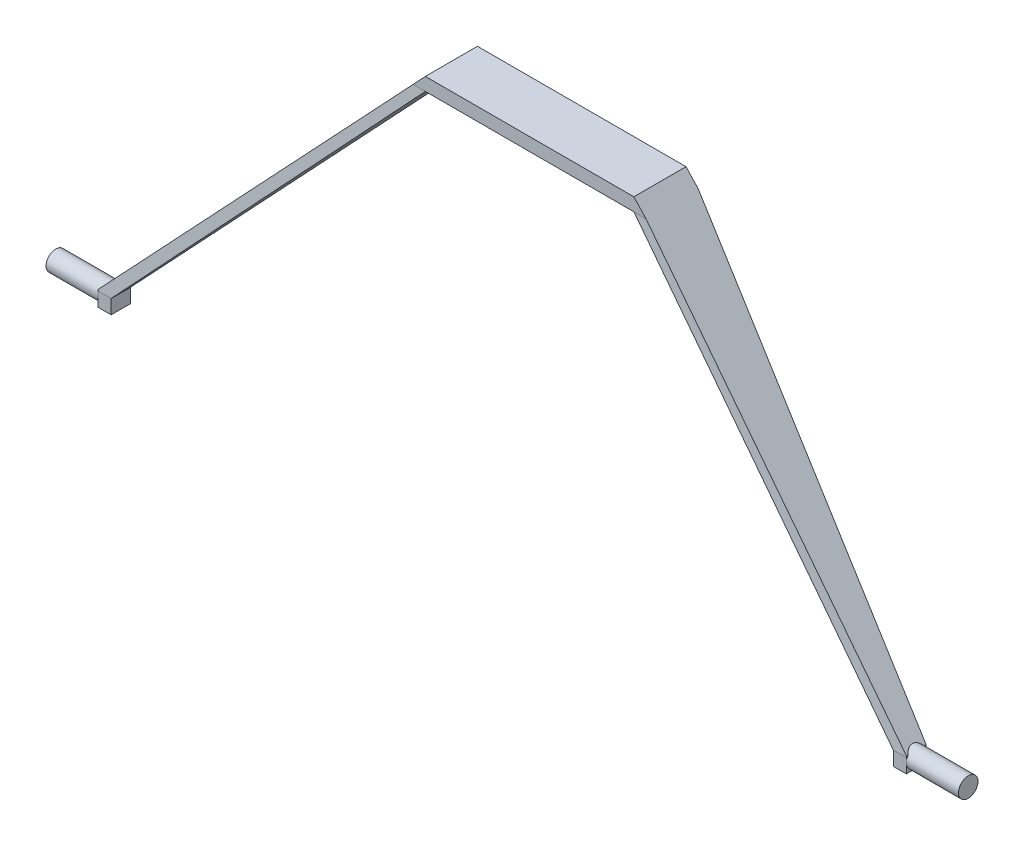
ISO-10303-21;
HEADER;
FILE_DESCRIPTION(('STEP AP214'),'2;1');
FILE_NAME('part.step','',(''),(''),'','','');
FILE_SCHEMA(('AUTOMOTIVE_DESIGN { 1 0 10303 214 1 1 1 1 }'));
ENDSEC;
DATA;
#1=APPLICATION_CONTEXT('core data for automotive mechanical design processes');
#2=APPLICATION_PROTOCOL_DEFINITION('international standard','automotive_design',2000,#1);
#3=PRODUCT_CONTEXT('',#1,'mechanical');
#4=PRODUCT('Part','Part','',(#3));
#5=PRODUCT_RELATED_PRODUCT_CATEGORY('part','',(#4));
#6=PRODUCT_DEFINITION_FORMATION('','',#4);
#7=PRODUCT_DEFINITION_CONTEXT('part definition',#1,'design');
#8=PRODUCT_DEFINITION('design','',#6,#7);
#9=PRODUCT_DEFINITION_SHAPE('','',#8);
#10=(LENGTH_UNIT() NAMED_UNIT(*) SI_UNIT(.MILLI.,.METRE.));
#11=(NAMED_UNIT(*) PLANE_ANGLE_UNIT() SI_UNIT($,.RADIAN.));
#12=(NAMED_UNIT(*) SI_UNIT($,.STERADIAN.) SOLID_ANGLE_UNIT());
#13=UNCERTAINTY_MEASURE_WITH_UNIT(LENGTH_MEASURE(1.E-05),#10,'distance_accuracy_value','');
#14=(GEOMETRIC_REPRESENTATION_CONTEXT(3) GLOBAL_UNCERTAINTY_ASSIGNED_CONTEXT((#13)) GLOBAL_UNIT_ASSIGNED_CONTEXT((#10,
#11,#12)) REPRESENTATION_CONTEXT('',''));
#15=CARTESIAN_POINT('',(0.,0.,0.));
#16=DIRECTION('',(0.,0.,1.));
#17=DIRECTION('',(1.,0.,0.));
#18=AXIS2_PLACEMENT_3D('',#15,#16,#17);
#19=CARTESIAN_POINT('',(-787.471663752112,-383.669201703355,-101.6));
#20=DIRECTION('',(-1.,0.,0.));
#21=DIRECTION('',(0.,0.,1.));
#22=AXIS2_PLACEMENT_3D('',#19,#20,#21);
#23=PLANE('',#22);
#24=DIRECTION('',(0.,1.,0.));
#25=VECTOR('',#24,1.);
#26=CARTESIAN_POINT('',(-787.471663752112,-383.669201703355,15.24));
#27=LINE('',#26,#25);
#28=CARTESIAN_POINT('',(-787.471663752112,-413.895201703355,15.24));
#29=VERTEX_POINT('',#28);
#30=CARTESIAN_POINT('',(-787.471663752112,-394.845201703355,15.24));
#31=VERTEX_POINT('',#30);
#32=EDGE_CURVE('E11',#29,#31,#27,.T.);
#33=ORIENTED_EDGE('',*,*,#32,.F.);
#34=DIRECTION('',(0.,0.,-1.));
#35=VECTOR('',#34,1.);
#36=CARTESIAN_POINT('',(-787.471663752112,-413.895201703355,15.24));
#37=LINE('',#36,#35);
#38=CARTESIAN_POINT('',(-787.471663752112,-413.895201703355,34.29));
#39=VERTEX_POINT('',#38);
#40=EDGE_CURVE('E54',#39,#29,#37,.T.);
#41=ORIENTED_EDGE('',*,*,#40,.F.);
#42=CARTESIAN_POINT('',(-787.471663752112,-394.845201703355,34.29));
#43=DIRECTION('',(-1.,0.,0.));
#44=DIRECTION('',(0.,0.,1.));
#45=AXIS2_PLACEMENT_3D('',#42,#43,#44);
#46=CIRCLE('',#45,19.05);
#47=EDGE_CURVE('E381',#39,#31,#46,.F.);
#48=ORIENTED_EDGE('',*,*,#47,.T.);
#49=EDGE_LOOP('',(#33,#41,#48));
#50=FACE_BOUND('',#49,.T.);
#51=ADVANCED_FACE('F38',(#50),#23,.T.);
#52=CARTESIAN_POINT('',(-787.471663752112,-394.845201703355,53.34));
#53=VERTEX_POINT('',#52);
#54=EDGE_CURVE('E390',#53,#39,#46,.F.);
#55=ORIENTED_EDGE('',*,*,#54,.T.);
#56=CARTESIAN_POINT('',(-787.471663752112,-413.895201703355,53.34));
#57=VERTEX_POINT('',#56);
#58=EDGE_CURVE('E351',#57,#39,#37,.T.);
#59=ORIENTED_EDGE('',*,*,#58,.F.);
#60=DIRECTION('',(0.,-1.,0.));
#61=VECTOR('',#60,1.);
#62=CARTESIAN_POINT('',(-787.471663752112,-383.669201703355,53.34));
#63=LINE('',#62,#61);
#64=EDGE_CURVE('E210',#53,#57,#63,.T.);
#65=ORIENTED_EDGE('',*,*,#64,.F.);
#66=EDGE_LOOP('',(#55,#59,#65));
#67=FACE_BOUND('',#66,.T.);
#68=ADVANCED_FACE('F478',(#67),#23,.T.);
#69=CARTESIAN_POINT('',(0.,0.,53.34));
#70=DIRECTION('',(0.,0.,1.));
#71=DIRECTION('',(1.,0.,0.));
#72=AXIS2_PLACEMENT_3D('',#69,#70,#71);
#73=PLANE('',#72);
#74=ORIENTED_EDGE('',*,*,#64,.T.);
#75=DIRECTION('',(1.,0.,0.));
#76=VECTOR('',#75,1.);
#77=CARTESIAN_POINT('',(-826.969276287555,-413.895201703355,53.34));
#78=LINE('',#77,#76);
#79=CARTESIAN_POINT('',(-762.071663752112,-413.895201703355,53.34));
#80=VERTEX_POINT('',#79);
#81=EDGE_CURVE('E453',#57,#80,#78,.T.);
#82=ORIENTED_EDGE('',*,*,#81,.T.);
#83=DIRECTION('',(0.,1.,0.));
#84=VECTOR('',#83,1.);
#85=CARTESIAN_POINT('',(-762.071663752112,-424.309201703355,53.34));
#86=LINE('',#85,#84);
#87=CARTESIAN_POINT('',(-762.071663752111,-386.209201703355,53.34));
#88=VERTEX_POINT('',#87);
#89=EDGE_CURVE('E219',#80,#88,#86,.T.);
#90=ORIENTED_EDGE('',*,*,#89,.T.);
#91=DIRECTION('',(1.,0.,0.));
#92=VECTOR('',#91,1.);
#93=CARTESIAN_POINT('',(0.,-386.209201703355,53.34));
#94=LINE('',#93,#92);
#95=CARTESIAN_POINT('',(-787.471663752112,-386.209201703355,53.34));
#96=VERTEX_POINT('',#95);
#97=EDGE_CURVE('E281',#96,#88,#94,.T.);
#98=ORIENTED_EDGE('',*,*,#97,.F.);
#99=EDGE_CURVE('E215',#96,#53,#63,.T.);
#100=ORIENTED_EDGE('',*,*,#99,.T.);
#101=EDGE_LOOP('',(#74,#82,#90,#98,#100));
#102=FACE_BOUND('',#101,.T.);
#103=ADVANCED_FACE('F452',(#102),#73,.T.);
#104=CARTESIAN_POINT('',(787.471663752112,-383.669201703355,-101.6));
#105=DIRECTION('',(1.,0.,0.));
#106=DIRECTION('',(0.,0.,-1.));
#107=AXIS2_PLACEMENT_3D('',#104,#105,#106);
#108=PLANE('',#107);
#109=DIRECTION('',(0.,1.,0.));
#110=VECTOR('',#109,1.);
#111=CARTESIAN_POINT('',(787.471663752112,-383.669201703355,53.34));
#112=LINE('',#111,#110);
#113=CARTESIAN_POINT('',(787.471663752112,-413.895201703355,53.34));
#114=VERTEX_POINT('',#113);
#115=CARTESIAN_POINT('',(787.471663752112,-394.845201703355,53.34));
#116=VERTEX_POINT('',#115);
#117=EDGE_CURVE('E227',#114,#116,#112,.T.);
#118=ORIENTED_EDGE('',*,*,#117,.F.);
#119=DIRECTION('',(0.,0.,-1.));
#120=VECTOR('',#119,1.);
#121=CARTESIAN_POINT('',(787.471663752112,-413.895201703355,15.24));
#122=LINE('',#121,#120);
#123=CARTESIAN_POINT('',(787.471663752112,-413.895201703355,34.29));
#124=VERTEX_POINT('',#123);
#125=EDGE_CURVE('E188',#114,#124,#122,.T.);
#126=ORIENTED_EDGE('',*,*,#125,.T.);
#127=CARTESIAN_POINT('',(787.471663752112,-394.845201703355,34.29));
#128=DIRECTION('',(1.,0.,0.));
#129=DIRECTION('',(0.,0.,-1.));
#130=AXIS2_PLACEMENT_3D('',#127,#128,#129);
#131=CIRCLE('',#130,19.05);
#132=EDGE_CURVE('E363',#116,#124,#131,.T.);
#133=ORIENTED_EDGE('',*,*,#132,.F.);
#134=EDGE_LOOP('',(#118,#126,#133));
#135=FACE_BOUND('',#134,.T.);
#136=ADVANCED_FACE('F493',(#135),#108,.T.);
#137=CARTESIAN_POINT('',(787.471663752112,-394.845201703355,15.24));
#138=VERTEX_POINT('',#137);
#139=EDGE_CURVE('E196',#124,#138,#131,.T.);
#140=ORIENTED_EDGE('',*,*,#139,.F.);
#141=CARTESIAN_POINT('',(787.471663752112,-413.895201703355,15.24));
#142=VERTEX_POINT('',#141);
#143=EDGE_CURVE('E181',#124,#142,#122,.T.);
#144=ORIENTED_EDGE('',*,*,#143,.T.);
#145=DIRECTION('',(0.,-1.,0.));
#146=VECTOR('',#145,1.);
#147=CARTESIAN_POINT('',(787.471663752112,-383.669201703355,15.24));
#148=LINE('',#147,#146);
#149=EDGE_CURVE('E194',#138,#142,#148,.T.);
#150=ORIENTED_EDGE('',*,*,#149,.F.);
#151=EDGE_LOOP('',(#140,#144,#150));
#152=FACE_BOUND('',#151,.T.);
#153=ADVANCED_FACE('F193',(#152),#108,.T.);
#154=CARTESIAN_POINT('',(762.071663752112,-424.309201703355,-101.6));
#155=DIRECTION('',(-1.,0.,0.));
#156=DIRECTION('',(0.,0.,1.));
#157=AXIS2_PLACEMENT_3D('',#154,#155,#156);
#158=PLANE('',#157);
#159=DIRECTION('',(0.,1.,0.));
#160=VECTOR('',#159,1.);
#161=CARTESIAN_POINT('',(762.071663752112,-424.309201703355,15.24));
#162=LINE('',#161,#160);
#163=CARTESIAN_POINT('',(762.071663752112,-413.895201703355,15.24));
#164=VERTEX_POINT('',#163);
#165=CARTESIAN_POINT('',(762.071663752112,-386.209201703355,15.24));
#166=VERTEX_POINT('',#165);
#167=EDGE_CURVE('E206',#164,#166,#162,.T.);
#168=ORIENTED_EDGE('',*,*,#167,.F.);
#169=DIRECTION('',(0.,0.,1.));
#170=VECTOR('',#169,1.);
#171=CARTESIAN_POINT('',(762.071663752112,-413.895201703355,-101.6));
#172=LINE('',#171,#170);
#173=CARTESIAN_POINT('',(762.071663752112,-413.895201703355,53.34));
#174=VERTEX_POINT('',#173);
#175=EDGE_CURVE('E62',#164,#174,#172,.T.);
#176=ORIENTED_EDGE('',*,*,#175,.T.);
#177=DIRECTION('',(0.,-1.,0.));
#178=VECTOR('',#177,1.);
#179=CARTESIAN_POINT('',(762.071663752112,-424.309201703355,53.34));
#180=LINE('',#179,#178);
#181=CARTESIAN_POINT('',(762.071663752112,-386.209201703355,53.34));
#182=VERTEX_POINT('',#181);
#183=EDGE_CURVE('E222',#182,#174,#180,.T.);
#184=ORIENTED_EDGE('',*,*,#183,.F.);
#185=DIRECTION('',(0.,0.,1.));
#186=VECTOR('',#185,1.);
#187=CARTESIAN_POINT('',(762.071663752112,-386.209201703355,-101.6));
#188=LINE('',#187,#186);
#189=EDGE_CURVE('E260',#166,#182,#188,.T.);
#190=ORIENTED_EDGE('',*,*,#189,.F.);
#191=EDGE_LOOP('',(#168,#176,#184,#190));
#192=FACE_BOUND('',#191,.T.);
#193=ADVANCED_FACE('F540',(#192),#158,.T.);
#194=CARTESIAN_POINT('',(-762.071663752112,-424.309201703355,-101.6));
#195=DIRECTION('',(1.,0.,0.));
#196=DIRECTION('',(0.,0.,-1.));
#197=AXIS2_PLACEMENT_3D('',#194,#195,#196);
#198=PLANE('',#197);
#199=ORIENTED_EDGE('',*,*,#89,.F.);
#200=DIRECTION('',(0.,0.,-1.));
#201=VECTOR('',#200,1.);
#202=CARTESIAN_POINT('',(-762.071663752112,-413.895201703355,-101.6));
#203=LINE('',#202,#201);
#204=CARTESIAN_POINT('',(-762.071663752112,-413.895201703355,15.24));
#205=VERTEX_POINT('',#204);
#206=EDGE_CURVE('E348',#80,#205,#203,.T.);
#207=ORIENTED_EDGE('',*,*,#206,.T.);
#208=DIRECTION('',(0.,-1.,0.));
#209=VECTOR('',#208,1.);
#210=CARTESIAN_POINT('',(-762.071663752112,-424.309201703355,15.24));
#211=LINE('',#210,#209);
#212=CARTESIAN_POINT('',(-762.071663752112,-386.209201703355,15.24));
#213=VERTEX_POINT('',#212);
#214=EDGE_CURVE('E211',#213,#205,#211,.T.);
#215=ORIENTED_EDGE('',*,*,#214,.F.);
#216=DIRECTION('',(0.,0.,1.));
#217=VECTOR('',#216,1.);
#218=CARTESIAN_POINT('',(-762.071663752112,-386.209201703355,-101.6));
#219=LINE('',#218,#217);
#220=EDGE_CURVE('E271',#213,#88,#219,.T.);
#221=ORIENTED_EDGE('',*,*,#220,.T.);
#222=EDGE_LOOP('',(#199,#207,#215,#221));
#223=FACE_BOUND('',#222,.T.);
#224=ADVANCED_FACE('F347',(#223),#198,.T.);
#225=ORIENTED_EDGE('',*,*,#183,.T.);
#226=EDGE_CURVE('E488',#174,#114,#78,.T.);
#227=ORIENTED_EDGE('',*,*,#226,.T.);
#228=ORIENTED_EDGE('',*,*,#117,.T.);
#229=CARTESIAN_POINT('',(787.471663752112,-386.209201703355,53.34));
#230=VERTEX_POINT('',#229);
#231=EDGE_CURVE('E226',#116,#230,#112,.T.);
#232=ORIENTED_EDGE('',*,*,#231,.T.);
#233=EDGE_CURVE('E250',#182,#230,#94,.T.);
#234=ORIENTED_EDGE('',*,*,#233,.F.);
#235=EDGE_LOOP('',(#225,#227,#228,#232,#234));
#236=FACE_BOUND('',#235,.T.);
#237=ADVANCED_FACE('F496',(#236),#73,.T.);
#238=CARTESIAN_POINT('',(-1297.03997230565,-386.209201703355,15.24));
#239=DIRECTION('',(0.,0.,1.));
#240=DIRECTION('',(0.,-1.,0.));
#241=AXIS2_PLACEMENT_3D('',#238,#239,#240);
#242=PLANE('',#241);
#243=DIRECTION('',(1.,0.,0.));
#244=VECTOR('',#243,1.);
#245=CARTESIAN_POINT('',(-826.969276287555,-413.895201703355,15.24));
#246=LINE('',#245,#244);
#247=EDGE_CURVE('E187',#29,#205,#246,.T.);
#248=ORIENTED_EDGE('',*,*,#247,.F.);
#249=ORIENTED_EDGE('',*,*,#32,.T.);
#250=CARTESIAN_POINT('',(-787.471663752112,-386.209201703355,15.24));
#251=VERTEX_POINT('',#250);
#252=EDGE_CURVE('E47',#31,#251,#27,.T.);
#253=ORIENTED_EDGE('',*,*,#252,.T.);
#254=DIRECTION('',(1.,0.,0.));
#255=VECTOR('',#254,1.);
#256=CARTESIAN_POINT('',(-1297.03997230565,-386.209201703355,15.24));
#257=LINE('',#256,#255);
#258=EDGE_CURVE('E343',#251,#213,#257,.T.);
#259=ORIENTED_EDGE('',*,*,#258,.T.);
#260=ORIENTED_EDGE('',*,*,#214,.T.);
#261=EDGE_LOOP('',(#248,#249,#253,#259,#260));
#262=FACE_BOUND('',#261,.T.);
#263=ADVANCED_FACE('F340',(#262),#242,.F.);
#264=EDGE_CURVE('E178',#164,#142,#246,.T.);
#265=ORIENTED_EDGE('',*,*,#264,.F.);
#266=ORIENTED_EDGE('',*,*,#167,.T.);
#267=CARTESIAN_POINT('',(787.471663752112,-386.209201703355,15.24));
#268=VERTEX_POINT('',#267);
#269=EDGE_CURVE('E395',#166,#268,#257,.T.);
#270=ORIENTED_EDGE('',*,*,#269,.T.);
#271=EDGE_CURVE('E204',#268,#138,#148,.T.);
#272=ORIENTED_EDGE('',*,*,#271,.T.);
#273=ORIENTED_EDGE('',*,*,#149,.T.);
#274=EDGE_LOOP('',(#265,#266,#270,#272,#273));
#275=FACE_BOUND('',#274,.T.);
#276=ADVANCED_FACE('F201',(#275),#242,.F.);
#277=CARTESIAN_POINT('',(787.471663752112,-383.669201703355,18.8627668067148));
#278=VERTEX_POINT('',#277);
#279=EDGE_CURVE('E371',#138,#278,#131,.T.);
#280=ORIENTED_EDGE('',*,*,#279,.F.);
#281=ORIENTED_EDGE('',*,*,#271,.F.);
#282=DIRECTION('',(0.,-0.981687652475557,0.190497645594452));
#283=VECTOR('',#282,1.);
#284=CARTESIAN_POINT('',(787.471663752112,-361.911223308586,10.5249486644394));
#285=LINE('',#284,#283);
#286=CARTESIAN_POINT('',(787.471663752112,-383.669201703355,14.7471100073535));
#287=VERTEX_POINT('',#286);
#288=EDGE_CURVE('E333',#287,#268,#285,.T.);
#289=ORIENTED_EDGE('',*,*,#288,.F.);
#290=DIRECTION('',(0.,0.,1.));
#291=VECTOR('',#290,1.);
#292=CARTESIAN_POINT('',(787.471663752112,-383.669201703355,-101.6));
#293=LINE('',#292,#291);
#294=EDGE_CURVE('E255',#287,#278,#293,.T.);
#295=ORIENTED_EDGE('',*,*,#294,.T.);
#296=EDGE_LOOP('',(#280,#281,#289,#295));
#297=FACE_BOUND('',#296,.T.);
#298=ADVANCED_FACE('F529',(#297),#108,.T.);
#299=CARTESIAN_POINT('',(787.471663752112,-383.669201703355,49.7172331932852));
#300=VERTEX_POINT('',#299);
#301=EDGE_CURVE('E366',#300,#116,#131,.T.);
#302=ORIENTED_EDGE('',*,*,#301,.F.);
#303=CARTESIAN_POINT('',(787.471663752112,-383.669201703355,53.114985003357));
#304=VERTEX_POINT('',#303);
#305=EDGE_CURVE('E259',#300,#304,#293,.T.);
#306=ORIENTED_EDGE('',*,*,#305,.T.);
#307=DIRECTION('',(0.,0.996098977899839,-0.0882429953418222));
#308=VECTOR('',#307,1.);
#309=CARTESIAN_POINT('',(787.471663752112,-370.069946760064,51.9102463004389));
#310=LINE('',#309,#308);
#311=EDGE_CURVE('E315',#230,#304,#310,.T.);
#312=ORIENTED_EDGE('',*,*,#311,.F.);
#313=ORIENTED_EDGE('',*,*,#231,.F.);
#314=EDGE_LOOP('',(#302,#306,#312,#313));
#315=FACE_BOUND('',#314,.T.);
#316=ADVANCED_FACE('F462',(#315),#108,.T.);
#317=ORIENTED_EDGE('',*,*,#252,.F.);
#318=CARTESIAN_POINT('',(-787.471663752112,-383.669201703355,18.8627668067146));
#319=VERTEX_POINT('',#318);
#320=EDGE_CURVE('E376',#31,#319,#46,.F.);
#321=ORIENTED_EDGE('',*,*,#320,.T.);
#322=DIRECTION('',(0.,0.,1.));
#323=VECTOR('',#322,1.);
#324=CARTESIAN_POINT('',(-787.471663752112,-383.669201703355,-101.6));
#325=LINE('',#324,#323);
#326=CARTESIAN_POINT('',(-787.471663752112,-383.669201703355,14.7471100073535));
#327=VERTEX_POINT('',#326);
#328=EDGE_CURVE('E275',#327,#319,#325,.T.);
#329=ORIENTED_EDGE('',*,*,#328,.F.);
#330=DIRECTION('',(0.,0.981687652475557,-0.190497645594452));
#331=VECTOR('',#330,1.);
#332=CARTESIAN_POINT('',(-787.471663752112,-361.911223308586,10.5249486644394));
#333=LINE('',#332,#331);
#334=EDGE_CURVE('E324',#251,#327,#333,.T.);
#335=ORIENTED_EDGE('',*,*,#334,.F.);
#336=EDGE_LOOP('',(#317,#321,#329,#335));
#337=FACE_BOUND('',#336,.T.);
#338=ADVANCED_FACE('F513',(#337),#23,.T.);
#339=CARTESIAN_POINT('',(-203.2,241.3,-101.6));
#340=DIRECTION('',(-0.730491181160132,0.682922128977583,0.));
#341=DIRECTION('',(-0.682922128977583,-0.730491181160132,0.));
#342=AXIS2_PLACEMENT_3D('',#339,#340,#341);
#343=PLANE('',#342);
#344=ORIENTED_EDGE('',*,*,#328,.T.);
#345=CARTESIAN_POINT('',(-797.919890794815,-394.845201703355,34.29));
#346=DIRECTION('',(-0.730491181160132,0.682922128977583,0.));
#347=DIRECTION('',(0.682922128977583,0.730491181160132,0.));
#348=AXIS2_PLACEMENT_3D('',#345,#346,#347);
#349=ELLIPSE('',#348,26.0783435739028,19.05);
#350=CARTESIAN_POINT('',(-787.471663752112,-383.669201703355,49.7172331932853));
#351=VERTEX_POINT('',#350);
#352=EDGE_CURVE('E380',#319,#351,#349,.F.);
#353=ORIENTED_EDGE('',*,*,#352,.T.);
#354=CARTESIAN_POINT('',(-787.471663752112,-383.669201703355,53.114985003357));
#355=VERTEX_POINT('',#354);
#356=EDGE_CURVE('E245',#351,#355,#325,.T.);
#357=ORIENTED_EDGE('',*,*,#356,.T.);
#358=DIRECTION('',(0.681496635621806,0.728966394832361,-0.0645780987740409));
#359=VECTOR('',#358,1.);
#360=CARTESIAN_POINT('',(-723.937929376007,-315.71001470586,47.094577037175));
#361=LINE('',#360,#359);
#362=CARTESIAN_POINT('',(-226.945970551598,215.9,0.));
#363=VERTEX_POINT('',#362);
#364=EDGE_CURVE('E404',#355,#363,#361,.T.);
#365=ORIENTED_EDGE('',*,*,#364,.T.);
#366=DIRECTION('',(0.682922128977583,0.730491181160132,0.));
#367=VECTOR('',#366,1.);
#368=CARTESIAN_POINT('',(-713.347967728877,-304.382407554465,0.));
#369=LINE('',#368,#367);
#370=CARTESIAN_POINT('',(-203.2,241.3,0.));
#371=VERTEX_POINT('',#370);
#372=EDGE_CURVE('E408',#363,#371,#369,.T.);
#373=ORIENTED_EDGE('',*,*,#372,.T.);
#374=DIRECTION('',(0.,0.,1.));
#375=VECTOR('',#374,1.);
#376=CARTESIAN_POINT('',(-203.2,241.3,-101.6));
#377=LINE('',#376,#375);
#378=CARTESIAN_POINT('',(-203.2,241.3,-101.6));
#379=VERTEX_POINT('',#378);
#380=EDGE_CURVE('E246',#379,#371,#377,.T.);
#381=ORIENTED_EDGE('',*,*,#380,.F.);
#382=DIRECTION('',(-0.682922128977583,-0.730491181160132,0.));
#383=VECTOR('',#382,1.);
#384=CARTESIAN_POINT('',(-203.2,241.3,-101.6));
#385=LINE('',#384,#383);
#386=CARTESIAN_POINT('',(-226.945970551598,215.9,-101.6));
#387=VERTEX_POINT('',#386);
#388=EDGE_CURVE('E230',#379,#387,#385,.T.);
#389=ORIENTED_EDGE('',*,*,#388,.T.);
#390=DIRECTION('',(-0.676162571687912,-0.723260785805915,0.140349607636784));
#391=VECTOR('',#390,1.);
#392=CARTESIAN_POINT('',(-716.188478747163,-307.420774830618,-0.048987063755182));
#393=LINE('',#392,#391);
#394=EDGE_CURVE('E391',#387,#327,#393,.T.);
#395=ORIENTED_EDGE('',*,*,#394,.T.);
#396=EDGE_LOOP('',(#344,#353,#357,#365,#373,#381,#389,#395));
#397=FACE_BOUND('',#396,.T.);
#398=ADVANCED_FACE('F40',(#397),#343,.T.);
#399=CARTESIAN_POINT('',(-203.2,241.3,-101.6));
#400=DIRECTION('',(0.,1.,0.));
#401=DIRECTION('',(-1.,0.,0.));
#402=AXIS2_PLACEMENT_3D('',#399,#400,#401);
#403=PLANE('',#402);
#404=DIRECTION('',(1.,0.,0.));
#405=VECTOR('',#404,1.);
#406=CARTESIAN_POINT('',(-1297.03997230565,241.3,0.));
#407=LINE('',#406,#405);
#408=CARTESIAN_POINT('',(203.2,241.3,0.));
#409=VERTEX_POINT('',#408);
#410=EDGE_CURVE('E317',#371,#409,#407,.T.);
#411=ORIENTED_EDGE('',*,*,#410,.T.);
#412=DIRECTION('',(0.,0.,1.));
#413=VECTOR('',#412,1.);
#414=CARTESIAN_POINT('',(203.2,241.3,-101.6));
#415=LINE('',#414,#413);
#416=CARTESIAN_POINT('',(203.2,241.3,-101.6));
#417=VERTEX_POINT('',#416);
#418=EDGE_CURVE('E251',#417,#409,#415,.T.);
#419=ORIENTED_EDGE('',*,*,#418,.F.);
#420=DIRECTION('',(-1.,0.,0.));
#421=VECTOR('',#420,1.);
#422=CARTESIAN_POINT('',(-203.2,241.3,-101.6));
#423=LINE('',#422,#421);
#424=EDGE_CURVE('E241',#417,#379,#423,.T.);
#425=ORIENTED_EDGE('',*,*,#424,.T.);
#426=ORIENTED_EDGE('',*,*,#380,.T.);
#427=EDGE_LOOP('',(#411,#419,#425,#426));
#428=FACE_BOUND('',#427,.T.);
#429=ADVANCED_FACE('F440',(#428),#403,.T.);
#430=CARTESIAN_POINT('',(203.2,241.3,-101.6));
#431=DIRECTION('',(0.730491181160132,0.682922128977584,0.));
#432=DIRECTION('',(-0.682922128977584,0.730491181160132,0.));
#433=AXIS2_PLACEMENT_3D('',#430,#431,#432);
#434=PLANE('',#433);
#435=CARTESIAN_POINT('',(797.919890794815,-394.845201703355,34.29));
#436=DIRECTION('',(0.730491181160132,0.682922128977584,0.));
#437=DIRECTION('',(-0.682922128977584,0.730491181160132,0.));
#438=AXIS2_PLACEMENT_3D('',#435,#436,#437);
#439=ELLIPSE('',#438,26.0783435739028,19.05);
#440=EDGE_CURVE('E367',#278,#300,#439,.T.);
#441=ORIENTED_EDGE('',*,*,#440,.F.);
#442=ORIENTED_EDGE('',*,*,#294,.F.);
#443=DIRECTION('',(0.676162571687912,-0.723260785805915,0.140349607636784));
#444=VECTOR('',#443,1.);
#445=CARTESIAN_POINT('',(716.188478747164,-307.420774830618,-0.0489870637551265));
#446=LINE('',#445,#444);
#447=CARTESIAN_POINT('',(226.945970551598,215.9,-101.6));
#448=VERTEX_POINT('',#447);
#449=EDGE_CURVE('E386',#448,#287,#446,.T.);
#450=ORIENTED_EDGE('',*,*,#449,.F.);
#451=DIRECTION('',(-0.682922128977583,0.730491181160132,0.));
#452=VECTOR('',#451,1.);
#453=CARTESIAN_POINT('',(203.2,241.3,-101.6));
#454=LINE('',#453,#452);
#455=EDGE_CURVE('E238',#448,#417,#454,.T.);
#456=ORIENTED_EDGE('',*,*,#455,.T.);
#457=ORIENTED_EDGE('',*,*,#418,.T.);
#458=DIRECTION('',(-0.682922128977584,0.730491181160132,0.));
#459=VECTOR('',#458,1.);
#460=CARTESIAN_POINT('',(713.347967728877,-304.382407554465,0.));
#461=LINE('',#460,#459);
#462=CARTESIAN_POINT('',(226.945970551598,215.9,0.));
#463=VERTEX_POINT('',#462);
#464=EDGE_CURVE('E405',#463,#409,#461,.T.);
#465=ORIENTED_EDGE('',*,*,#464,.F.);
#466=DIRECTION('',(-0.681496635621806,0.728966394832361,-0.0645780987740408));
#467=VECTOR('',#466,1.);
#468=CARTESIAN_POINT('',(723.937929376008,-315.71001470586,47.094577037175));
#469=LINE('',#468,#467);
#470=EDGE_CURVE('E400',#304,#463,#469,.T.);
#471=ORIENTED_EDGE('',*,*,#470,.F.);
#472=ORIENTED_EDGE('',*,*,#305,.F.);
#473=EDGE_LOOP('',(#441,#442,#450,#456,#457,#465,#471,#472));
#474=FACE_BOUND('',#473,.T.);
#475=ADVANCED_FACE('F435',(#474),#434,.T.);
#476=CARTESIAN_POINT('',(762.071663752112,-386.209201703355,-101.6));
#477=DIRECTION('',(-0.732932920293633,-0.680300914559025,0.));
#478=DIRECTION('',(0.680300914559025,-0.732932920293633,0.));
#479=AXIS2_PLACEMENT_3D('',#476,#477,#478);
#480=PLANE('',#479);
#481=DIRECTION('',(-0.673522882906171,0.725630500986452,-0.140809453659583));
#482=VECTOR('',#481,1.);
#483=CARTESIAN_POINT('',(750.990746361577,-374.271000579751,12.9233780062889));
#484=LINE('',#483,#482);
#485=CARTESIAN_POINT('',(203.2,215.9,-101.6));
#486=VERTEX_POINT('',#485);
#487=EDGE_CURVE('E330',#166,#486,#484,.T.);
#488=ORIENTED_EDGE('',*,*,#487,.F.);
#489=ORIENTED_EDGE('',*,*,#189,.T.);
#490=DIRECTION('',(0.678871413535743,-0.731392824819506,0.0647930527643605));
#491=VECTOR('',#490,1.);
#492=CARTESIAN_POINT('',(755.256449466988,-378.866723100837,52.6895402369698));
#493=LINE('',#492,#491);
#494=CARTESIAN_POINT('',(203.2,215.9,0.));
#495=VERTEX_POINT('',#494);
#496=EDGE_CURVE('E310',#495,#182,#493,.T.);
#497=ORIENTED_EDGE('',*,*,#496,.F.);
#498=DIRECTION('',(0.,0.,1.));
#499=VECTOR('',#498,1.);
#500=CARTESIAN_POINT('',(203.2,215.9,-101.6));
#501=LINE('',#500,#499);
#502=EDGE_CURVE('E263',#486,#495,#501,.T.);
#503=ORIENTED_EDGE('',*,*,#502,.F.);
#504=EDGE_LOOP('',(#488,#489,#497,#503));
#505=FACE_BOUND('',#504,.T.);
#506=ADVANCED_FACE('F537',(#505),#480,.T.);
#507=CARTESIAN_POINT('',(-203.2,215.9,-101.6));
#508=DIRECTION('',(0.,-1.,0.));
#509=DIRECTION('',(1.,0.,0.));
#510=AXIS2_PLACEMENT_3D('',#507,#508,#509);
#511=PLANE('',#510);
#512=DIRECTION('',(1.,0.,0.));
#513=VECTOR('',#512,1.);
#514=CARTESIAN_POINT('',(-1297.03997230565,215.9,0.));
#515=LINE('',#514,#513);
#516=CARTESIAN_POINT('',(-203.2,215.9,0.));
#517=VERTEX_POINT('',#516);
#518=EDGE_CURVE('E420',#517,#495,#515,.T.);
#519=ORIENTED_EDGE('',*,*,#518,.F.);
#520=DIRECTION('',(0.,0.,1.));
#521=VECTOR('',#520,1.);
#522=CARTESIAN_POINT('',(-203.2,215.9,-101.6));
#523=LINE('',#522,#521);
#524=CARTESIAN_POINT('',(-203.2,215.9,-101.6));
#525=VERTEX_POINT('',#524);
#526=EDGE_CURVE('E267',#525,#517,#523,.T.);
#527=ORIENTED_EDGE('',*,*,#526,.F.);
#528=DIRECTION('',(1.,0.,0.));
#529=VECTOR('',#528,1.);
#530=CARTESIAN_POINT('',(-203.2,215.9,-101.6));
#531=LINE('',#530,#529);
#532=EDGE_CURVE('E234',#525,#486,#531,.T.);
#533=ORIENTED_EDGE('',*,*,#532,.T.);
#534=ORIENTED_EDGE('',*,*,#502,.T.);
#535=EDGE_LOOP('',(#519,#527,#533,#534));
#536=FACE_BOUND('',#535,.T.);
#537=ADVANCED_FACE('F521',(#536),#511,.T.);
#538=CARTESIAN_POINT('',(-762.071663752112,-386.209201703355,-101.6));
#539=DIRECTION('',(0.732932920293634,-0.680300914559025,0.));
#540=DIRECTION('',(0.680300914559025,0.732932920293634,0.));
#541=AXIS2_PLACEMENT_3D('',#538,#539,#540);
#542=PLANE('',#541);
#543=DIRECTION('',(-0.673522882906171,-0.725630500986452,0.140809453659583));
#544=VECTOR('',#543,1.);
#545=CARTESIAN_POINT('',(-750.990746361577,-374.271000579751,12.9233780062889));
#546=LINE('',#545,#544);
#547=EDGE_CURVE('E327',#525,#213,#546,.T.);
#548=ORIENTED_EDGE('',*,*,#547,.F.);
#549=ORIENTED_EDGE('',*,*,#526,.T.);
#550=DIRECTION('',(0.678871413535743,0.731392824819506,-0.0647930527643606));
#551=VECTOR('',#550,1.);
#552=CARTESIAN_POINT('',(-755.256449466988,-378.866723100838,52.6895402369698));
#553=LINE('',#552,#551);
#554=EDGE_CURVE('E297',#88,#517,#553,.T.);
#555=ORIENTED_EDGE('',*,*,#554,.F.);
#556=ORIENTED_EDGE('',*,*,#220,.F.);
#557=EDGE_LOOP('',(#548,#549,#555,#556));
#558=FACE_BOUND('',#557,.T.);
#559=ADVANCED_FACE('F307',(#558),#542,.T.);
#560=ORIENTED_EDGE('',*,*,#356,.F.);
#561=EDGE_CURVE('E382',#351,#53,#46,.F.);
#562=ORIENTED_EDGE('',*,*,#561,.T.);
#563=ORIENTED_EDGE('',*,*,#99,.F.);
#564=DIRECTION('',(0.,-0.996098977899839,0.0882429953418222));
#565=VECTOR('',#564,1.);
#566=CARTESIAN_POINT('',(-787.471663752112,-370.069946760064,51.9102463004389));
#567=LINE('',#566,#565);
#568=EDGE_CURVE('E301',#355,#96,#567,.T.);
#569=ORIENTED_EDGE('',*,*,#568,.F.);
#570=EDGE_LOOP('',(#560,#562,#563,#569));
#571=FACE_BOUND('',#570,.T.);
#572=ADVANCED_FACE('F448',(#571),#23,.T.);
#573=CARTESIAN_POINT('',(0.,0.,-101.6));
#574=DIRECTION('',(0.,0.,1.));
#575=DIRECTION('',(1.,0.,0.));
#576=AXIS2_PLACEMENT_3D('',#573,#574,#575);
#577=PLANE('',#576);
#578=ORIENTED_EDGE('',*,*,#455,.F.);
#579=DIRECTION('',(-1.,0.,0.));
#580=VECTOR('',#579,1.);
#581=CARTESIAN_POINT('',(0.,215.9,-101.6));
#582=LINE('',#581,#580);
#583=EDGE_CURVE('E282',#448,#486,#582,.T.);
#584=ORIENTED_EDGE('',*,*,#583,.T.);
#585=ORIENTED_EDGE('',*,*,#532,.F.);
#586=DIRECTION('',(1.,0.,0.));
#587=VECTOR('',#586,1.);
#588=CARTESIAN_POINT('',(-1297.03997230565,215.9,-101.6));
#589=LINE('',#588,#587);
#590=EDGE_CURVE('E389',#387,#525,#589,.T.);
#591=ORIENTED_EDGE('',*,*,#590,.F.);
#592=ORIENTED_EDGE('',*,*,#388,.F.);
#593=ORIENTED_EDGE('',*,*,#424,.F.);
#594=EDGE_LOOP('',(#578,#584,#585,#591,#592,#593));
#595=FACE_BOUND('',#594,.T.);
#596=ADVANCED_FACE('F442',(#595),#577,.F.);
#597=CARTESIAN_POINT('',(-1297.03997230565,215.9,0.));
#598=DIRECTION('',(0.,-0.0882429953418222,-0.996098977899839));
#599=DIRECTION('',(0.,0.996098977899839,-0.0882429953418222));
#600=AXIS2_PLACEMENT_3D('',#597,#598,#599);
#601=PLANE('',#600);
#602=ORIENTED_EDGE('',*,*,#311,.T.);
#603=ORIENTED_EDGE('',*,*,#470,.T.);
#604=EDGE_CURVE('E416',#495,#463,#515,.T.);
#605=ORIENTED_EDGE('',*,*,#604,.F.);
#606=ORIENTED_EDGE('',*,*,#496,.T.);
#607=ORIENTED_EDGE('',*,*,#233,.T.);
#608=EDGE_LOOP('',(#602,#603,#605,#606,#607));
#609=FACE_BOUND('',#608,.T.);
#610=ADVANCED_FACE('F431',(#609),#601,.F.);
#611=ORIENTED_EDGE('',*,*,#554,.T.);
#612=EDGE_CURVE('E412',#363,#517,#515,.T.);
#613=ORIENTED_EDGE('',*,*,#612,.F.);
#614=ORIENTED_EDGE('',*,*,#364,.F.);
#615=ORIENTED_EDGE('',*,*,#568,.T.);
#616=ORIENTED_EDGE('',*,*,#97,.T.);
#617=EDGE_LOOP('',(#611,#613,#614,#615,#616));
#618=FACE_BOUND('',#617,.T.);
#619=ADVANCED_FACE('F295',(#618),#601,.F.);
#620=CARTESIAN_POINT('',(-1297.03997230565,241.3,0.));
#621=DIRECTION('',(0.,0.,-1.));
#622=DIRECTION('',(-1.,0.,0.));
#623=AXIS2_PLACEMENT_3D('',#620,#621,#622);
#624=PLANE('',#623);
#625=ORIENTED_EDGE('',*,*,#612,.T.);
#626=ORIENTED_EDGE('',*,*,#518,.T.);
#627=ORIENTED_EDGE('',*,*,#604,.T.);
#628=ORIENTED_EDGE('',*,*,#464,.T.);
#629=ORIENTED_EDGE('',*,*,#410,.F.);
#630=ORIENTED_EDGE('',*,*,#372,.F.);
#631=EDGE_LOOP('',(#625,#626,#627,#628,#629,#630));
#632=FACE_BOUND('',#631,.T.);
#633=ADVANCED_FACE('F426',(#632),#624,.F.);
#634=CARTESIAN_POINT('',(-1297.03997230565,215.9,-101.6));
#635=DIRECTION('',(0.,0.190497645594452,0.981687652475557));
#636=DIRECTION('',(0.,-0.981687652475557,0.190497645594452));
#637=AXIS2_PLACEMENT_3D('',#634,#635,#636);
#638=PLANE('',#637);
#639=ORIENTED_EDGE('',*,*,#547,.T.);
#640=ORIENTED_EDGE('',*,*,#258,.F.);
#641=ORIENTED_EDGE('',*,*,#334,.T.);
#642=ORIENTED_EDGE('',*,*,#394,.F.);
#643=ORIENTED_EDGE('',*,*,#590,.T.);
#644=EDGE_LOOP('',(#639,#640,#641,#642,#643));
#645=FACE_BOUND('',#644,.T.);
#646=ADVANCED_FACE('F533',(#645),#638,.F.);
#647=ORIENTED_EDGE('',*,*,#288,.T.);
#648=ORIENTED_EDGE('',*,*,#269,.F.);
#649=ORIENTED_EDGE('',*,*,#487,.T.);
#650=ORIENTED_EDGE('',*,*,#583,.F.);
#651=ORIENTED_EDGE('',*,*,#449,.T.);
#652=EDGE_LOOP('',(#647,#648,#649,#650,#651));
#653=FACE_BOUND('',#652,.T.);
#654=ADVANCED_FACE('F543',(#653),#638,.F.);
#655=CARTESIAN_POINT('',(-889.071663752112,-394.845201703355,34.29));
#656=DIRECTION('',(1.,0.,0.));
#657=DIRECTION('',(0.,0.,-1.));
#658=AXIS2_PLACEMENT_3D('',#655,#656,#657);
#659=CYLINDRICAL_SURFACE('',#658,19.05);
#660=ORIENTED_EDGE('',*,*,#54,.F.);
#661=ORIENTED_EDGE('',*,*,#561,.F.);
#662=ORIENTED_EDGE('',*,*,#352,.F.);
#663=ORIENTED_EDGE('',*,*,#320,.F.);
#664=ORIENTED_EDGE('',*,*,#47,.F.);
#665=EDGE_LOOP('',(#660,#661,#662,#663,#664));
#666=FACE_BOUND('',#665,.T.);
#667=CARTESIAN_POINT('',(-889.071663752112,-394.845201703355,34.29));
#668=DIRECTION('',(-1.,0.,0.));
#669=DIRECTION('',(0.,0.,1.));
#670=AXIS2_PLACEMENT_3D('',#667,#668,#669);
#671=CIRCLE('',#670,19.05);
#672=CARTESIAN_POINT('',(-889.071663752112,-394.845201703355,53.34));
#673=VERTEX_POINT('',#672);
#674=EDGE_CURVE('E372',#673,#673,#671,.T.);
#675=ORIENTED_EDGE('',*,*,#674,.F.);
#676=EDGE_LOOP('',(#675));
#677=FACE_BOUND('',#676,.T.);
#678=ADVANCED_FACE('F481',(#666,#677),#659,.T.);
#679=CARTESIAN_POINT('',(-889.071663752112,-394.845201703355,34.29));
#680=DIRECTION('',(-1.,0.,0.));
#681=DIRECTION('',(0.,0.,1.));
#682=AXIS2_PLACEMENT_3D('',#679,#680,#681);
#683=PLANE('',#682);
#684=ORIENTED_EDGE('',*,*,#674,.T.);
#685=EDGE_LOOP('',(#684));
#686=FACE_BOUND('',#685,.T.);
#687=ADVANCED_FACE('F609',(#686),#683,.T.);
#688=CARTESIAN_POINT('',(889.071663752112,-394.845201703355,34.29));
#689=DIRECTION('',(-1.,0.,0.));
#690=DIRECTION('',(0.,0.,1.));
#691=AXIS2_PLACEMENT_3D('',#688,#689,#690);
#692=CYLINDRICAL_SURFACE('',#691,19.05);
#693=CARTESIAN_POINT('',(889.071663752112,-394.845201703355,34.29));
#694=DIRECTION('',(-1.,0.,0.));
#695=DIRECTION('',(0.,0.,1.));
#696=AXIS2_PLACEMENT_3D('',#693,#694,#695);
#697=CIRCLE('',#696,19.05);
#698=CARTESIAN_POINT('',(889.071663752112,-394.845201703355,53.34));
#699=VERTEX_POINT('',#698);
#700=EDGE_CURVE('E355',#699,#699,#697,.T.);
#701=ORIENTED_EDGE('',*,*,#700,.T.);
#702=EDGE_LOOP('',(#701));
#703=FACE_BOUND('',#702,.T.);
#704=ORIENTED_EDGE('',*,*,#132,.T.);
#705=ORIENTED_EDGE('',*,*,#139,.T.);
#706=ORIENTED_EDGE('',*,*,#279,.T.);
#707=ORIENTED_EDGE('',*,*,#440,.T.);
#708=ORIENTED_EDGE('',*,*,#301,.T.);
#709=EDGE_LOOP('',(#704,#705,#706,#707,#708));
#710=FACE_BOUND('',#709,.T.);
#711=ADVANCED_FACE('F468',(#703,#710),#692,.T.);
#712=CARTESIAN_POINT('',(889.071663752112,-394.845201703355,34.29));
#713=DIRECTION('',(1.,0.,0.));
#714=DIRECTION('',(0.,0.,1.));
#715=AXIS2_PLACEMENT_3D('',#712,#713,#714);
#716=PLANE('',#715);
#717=ORIENTED_EDGE('',*,*,#700,.F.);
#718=EDGE_LOOP('',(#717));
#719=FACE_BOUND('',#718,.T.);
#720=ADVANCED_FACE('F507',(#719),#716,.T.);
#721=CARTESIAN_POINT('',(-826.969276287555,-413.895201703355,15.24));
#722=DIRECTION('',(0.,-1.,0.));
#723=DIRECTION('',(0.,0.,-1.));
#724=AXIS2_PLACEMENT_3D('',#721,#722,#723);
#725=PLANE('',#724);
#726=ORIENTED_EDGE('',*,*,#264,.T.);
#727=ORIENTED_EDGE('',*,*,#143,.F.);
#728=ORIENTED_EDGE('',*,*,#125,.F.);
#729=ORIENTED_EDGE('',*,*,#226,.F.);
#730=ORIENTED_EDGE('',*,*,#175,.F.);
#731=EDGE_LOOP('',(#726,#727,#728,#729,#730));
#732=FACE_BOUND('',#731,.T.);
#733=ADVANCED_FACE('F180',(#732),#725,.T.);
#734=ORIENTED_EDGE('',*,*,#81,.F.);
#735=ORIENTED_EDGE('',*,*,#58,.T.);
#736=ORIENTED_EDGE('',*,*,#40,.T.);
#737=ORIENTED_EDGE('',*,*,#247,.T.);
#738=ORIENTED_EDGE('',*,*,#206,.F.);
#739=EDGE_LOOP('',(#734,#735,#736,#737,#738));
#740=FACE_BOUND('',#739,.T.);
#741=ADVANCED_FACE('F501',(#740),#725,.T.);
#742=CLOSED_SHELL('',(#51,#68,#103,#136,#153,#193,#224,#237,#263,#276,#298,#316,#338,#398,#429,
#475,#506,#537,#559,#572,#596,#610,#619,#633,#646,#654,#678,#687,#711,#720,#733,#741));
#743=MANIFOLD_SOLID_BREP('B2',#742);
#744=ADVANCED_BREP_SHAPE_REPRESENTATION('',(#18,#743),#14);
#745=SHAPE_DEFINITION_REPRESENTATION(#9,#744);
ENDSEC;
END-ISO-10303-21;
